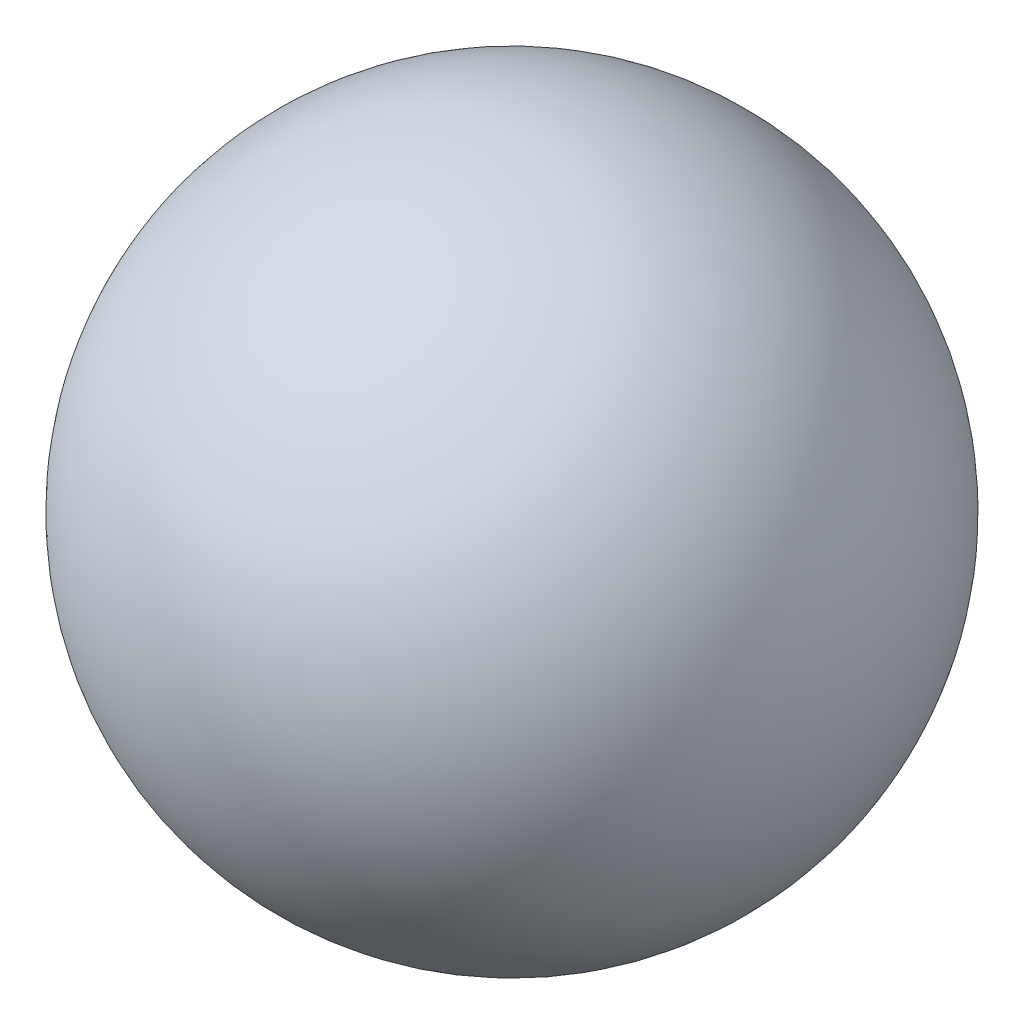
ISO-10303-21;
HEADER;
FILE_DESCRIPTION(('STEP AP214'),'2;1');
FILE_NAME('part.step','',(''),(''),'','','');
FILE_SCHEMA(('AUTOMOTIVE_DESIGN { 1 0 10303 214 1 1 1 1 }'));
ENDSEC;
DATA;
#1=APPLICATION_CONTEXT('core data for automotive mechanical design processes');
#2=APPLICATION_PROTOCOL_DEFINITION('international standard','automotive_design',2000,#1);
#3=PRODUCT_CONTEXT('',#1,'mechanical');
#4=PRODUCT('Part','Part','',(#3));
#5=PRODUCT_RELATED_PRODUCT_CATEGORY('part','',(#4));
#6=PRODUCT_DEFINITION_FORMATION('','',#4);
#7=PRODUCT_DEFINITION_CONTEXT('part definition',#1,'design');
#8=PRODUCT_DEFINITION('design','',#6,#7);
#9=PRODUCT_DEFINITION_SHAPE('','',#8);
#10=(LENGTH_UNIT() NAMED_UNIT(*) SI_UNIT(.MILLI.,.METRE.));
#11=(NAMED_UNIT(*) PLANE_ANGLE_UNIT() SI_UNIT($,.RADIAN.));
#12=(NAMED_UNIT(*) SI_UNIT($,.STERADIAN.) SOLID_ANGLE_UNIT());
#13=UNCERTAINTY_MEASURE_WITH_UNIT(LENGTH_MEASURE(1.E-05),#10,'distance_accuracy_value','');
#14=(GEOMETRIC_REPRESENTATION_CONTEXT(3) GLOBAL_UNCERTAINTY_ASSIGNED_CONTEXT((#13)) GLOBAL_UNIT_ASSIGNED_CONTEXT((#10,
#11,#12)) REPRESENTATION_CONTEXT('',''));
#15=CARTESIAN_POINT('',(0.,0.,0.));
#16=DIRECTION('',(0.,0.,1.));
#17=DIRECTION('',(1.,0.,0.));
#18=AXIS2_PLACEMENT_3D('',#15,#16,#17);
#19=CARTESIAN_POINT('',(0.,0.,0.));
#20=DIRECTION('',(-1.,0.,0.));
#21=DIRECTION('',(0.,1.,0.));
#22=AXIS2_PLACEMENT_3D('',#19,#20,#21);
#23=SPHERICAL_SURFACE('',#22,0.8);
#24=CARTESIAN_POINT('',(-0.8,0.,0.));
#25=VERTEX_POINT('',#24);
#26=VERTEX_LOOP('',#25);
#27=FACE_BOUND('',#26,.T.);
#28=ADVANCED_FACE('F35',(#27),#23,.T.);
#29=CLOSED_SHELL('',(#28));
#30=MANIFOLD_SOLID_BREP('B2',#29);
#31=ADVANCED_BREP_SHAPE_REPRESENTATION('',(#18,#30),#14);
#32=SHAPE_DEFINITION_REPRESENTATION(#9,#31);
ENDSEC;
END-ISO-10303-21;
